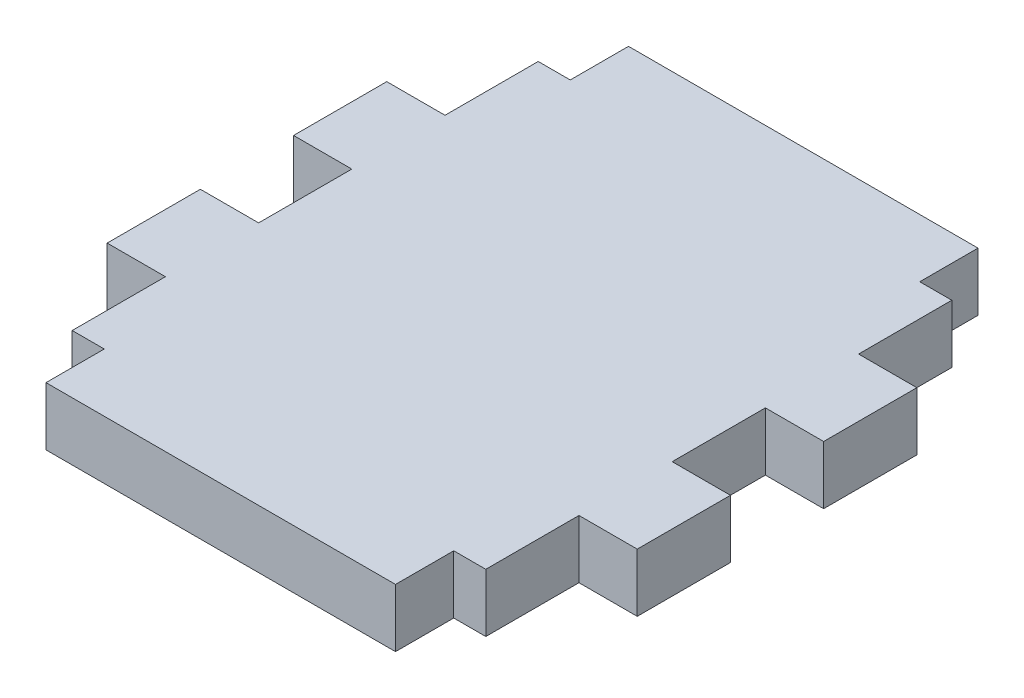
ISO-10303-21;
HEADER;
FILE_DESCRIPTION(('STEP AP214'),'2;1');
FILE_NAME('part.step','',(''),(''),'','','');
FILE_SCHEMA(('AUTOMOTIVE_DESIGN { 1 0 10303 214 1 1 1 1 }'));
ENDSEC;
DATA;
#1=APPLICATION_CONTEXT('core data for automotive mechanical design processes');
#2=APPLICATION_PROTOCOL_DEFINITION('international standard','automotive_design',2000,#1);
#3=PRODUCT_CONTEXT('',#1,'mechanical');
#4=PRODUCT('Part','Part','',(#3));
#5=PRODUCT_RELATED_PRODUCT_CATEGORY('part','',(#4));
#6=PRODUCT_DEFINITION_FORMATION('','',#4);
#7=PRODUCT_DEFINITION_CONTEXT('part definition',#1,'design');
#8=PRODUCT_DEFINITION('design','',#6,#7);
#9=PRODUCT_DEFINITION_SHAPE('','',#8);
#10=(LENGTH_UNIT() NAMED_UNIT(*) SI_UNIT(.MILLI.,.METRE.));
#11=(NAMED_UNIT(*) PLANE_ANGLE_UNIT() SI_UNIT($,.RADIAN.));
#12=(NAMED_UNIT(*) SI_UNIT($,.STERADIAN.) SOLID_ANGLE_UNIT());
#13=UNCERTAINTY_MEASURE_WITH_UNIT(LENGTH_MEASURE(1.E-05),#10,'distance_accuracy_value','');
#14=(GEOMETRIC_REPRESENTATION_CONTEXT(3) GLOBAL_UNCERTAINTY_ASSIGNED_CONTEXT((#13)) GLOBAL_UNIT_ASSIGNED_CONTEXT((#10,
#11,#12)) REPRESENTATION_CONTEXT('',''));
#15=CARTESIAN_POINT('',(0.,0.,0.));
#16=DIRECTION('',(0.,0.,1.));
#17=DIRECTION('',(1.,0.,0.));
#18=AXIS2_PLACEMENT_3D('',#15,#16,#17);
#19=CARTESIAN_POINT('',(-56.4007350410217,3.,-6.46052951119867));
#20=DIRECTION('',(0.,0.,1.));
#21=DIRECTION('',(1.,0.,0.));
#22=AXIS2_PLACEMENT_3D('',#19,#20,#21);
#23=PLANE('',#22);
#24=DIRECTION('',(-1.,0.,0.));
#25=VECTOR('',#24,1.);
#26=CARTESIAN_POINT('',(-56.4007350410217,0.,-6.46052951119867));
#27=LINE('',#26,#25);
#28=CARTESIAN_POINT('',(-56.4007350410217,0.,-6.46052951119867));
#29=VERTEX_POINT('',#28);
#30=CARTESIAN_POINT('',(-58.0507350410217,0.,-6.46052951119867));
#31=VERTEX_POINT('',#30);
#32=EDGE_CURVE('E260',#29,#31,#27,.T.);
#33=ORIENTED_EDGE('',*,*,#32,.T.);
#34=DIRECTION('',(0.,-1.,0.));
#35=VECTOR('',#34,1.);
#36=CARTESIAN_POINT('',(-58.0507350410217,3.,-6.46052951119867));
#37=LINE('',#36,#35);
#38=CARTESIAN_POINT('',(-58.0507350410217,3.,-6.46052951119867));
#39=VERTEX_POINT('',#38);
#40=EDGE_CURVE('E11',#39,#31,#37,.T.);
#41=ORIENTED_EDGE('',*,*,#40,.F.);
#42=DIRECTION('',(-1.,0.,0.));
#43=VECTOR('',#42,1.);
#44=CARTESIAN_POINT('',(-56.4007350410217,3.,-6.46052951119867));
#45=LINE('',#44,#43);
#46=CARTESIAN_POINT('',(-56.4007350410217,3.,-6.46052951119867));
#47=VERTEX_POINT('',#46);
#48=EDGE_CURVE('E342',#47,#39,#45,.T.);
#49=ORIENTED_EDGE('',*,*,#48,.F.);
#50=DIRECTION('',(0.,-1.,0.));
#51=VECTOR('',#50,1.);
#52=CARTESIAN_POINT('',(-56.4007350410217,3.,-6.46052951119867));
#53=LINE('',#52,#51);
#54=EDGE_CURVE('E256',#47,#29,#53,.T.);
#55=ORIENTED_EDGE('',*,*,#54,.T.);
#56=EDGE_LOOP('',(#33,#41,#49,#55));
#57=FACE_BOUND('',#56,.T.);
#58=ADVANCED_FACE('F39',(#57),#23,.F.);
#59=CARTESIAN_POINT('',(-58.0507350410217,3.,-6.46052951119867));
#60=DIRECTION('',(1.,0.,0.));
#61=DIRECTION('',(0.,0.,-1.));
#62=AXIS2_PLACEMENT_3D('',#59,#60,#61);
#63=PLANE('',#62);
#64=DIRECTION('',(0.,0.,1.));
#65=VECTOR('',#64,1.);
#66=CARTESIAN_POINT('',(-58.0507350410217,0.,-6.46052951119867));
#67=LINE('',#66,#65);
#68=CARTESIAN_POINT('',(-58.0507350410217,0.,-1.66052951119866));
#69=VERTEX_POINT('',#68);
#70=EDGE_CURVE('E264',#31,#69,#67,.T.);
#71=ORIENTED_EDGE('',*,*,#70,.T.);
#72=DIRECTION('',(0.,-1.,0.));
#73=VECTOR('',#72,1.);
#74=CARTESIAN_POINT('',(-58.0507350410217,3.,-1.66052951119866));
#75=LINE('',#74,#73);
#76=CARTESIAN_POINT('',(-58.0507350410217,3.,-1.66052951119866));
#77=VERTEX_POINT('',#76);
#78=EDGE_CURVE('E48',#77,#69,#75,.T.);
#79=ORIENTED_EDGE('',*,*,#78,.F.);
#80=DIRECTION('',(0.,0.,1.));
#81=VECTOR('',#80,1.);
#82=CARTESIAN_POINT('',(-58.0507350410217,3.,-6.46052951119867));
#83=LINE('',#82,#81);
#84=EDGE_CURVE('E159',#39,#77,#83,.T.);
#85=ORIENTED_EDGE('',*,*,#84,.F.);
#86=ORIENTED_EDGE('',*,*,#40,.T.);
#87=EDGE_LOOP('',(#71,#79,#85,#86));
#88=FACE_BOUND('',#87,.T.);
#89=ADVANCED_FACE('F548',(#88),#63,.F.);
#90=CARTESIAN_POINT('',(-61.0507350410217,3.,-1.66052951119866));
#91=DIRECTION('',(0.,0.,1.));
#92=DIRECTION('',(1.,0.,0.));
#93=AXIS2_PLACEMENT_3D('',#90,#91,#92);
#94=PLANE('',#93);
#95=DIRECTION('',(-1.,0.,0.));
#96=VECTOR('',#95,1.);
#97=CARTESIAN_POINT('',(-61.0507350410217,0.,-1.66052951119866));
#98=LINE('',#97,#96);
#99=CARTESIAN_POINT('',(-61.0507350410217,0.,-1.66052951119866));
#100=VERTEX_POINT('',#99);
#101=EDGE_CURVE('E267',#69,#100,#98,.T.);
#102=ORIENTED_EDGE('',*,*,#101,.T.);
#103=DIRECTION('',(0.,-1.,0.));
#104=VECTOR('',#103,1.);
#105=CARTESIAN_POINT('',(-61.0507350410217,3.,-1.66052951119866));
#106=LINE('',#105,#104);
#107=CARTESIAN_POINT('',(-61.0507350410217,3.,-1.66052951119866));
#108=VERTEX_POINT('',#107);
#109=EDGE_CURVE('E433',#108,#100,#106,.T.);
#110=ORIENTED_EDGE('',*,*,#109,.F.);
#111=DIRECTION('',(-1.,0.,0.));
#112=VECTOR('',#111,1.);
#113=CARTESIAN_POINT('',(-61.0507350410217,3.,-1.66052951119866));
#114=LINE('',#113,#112);
#115=EDGE_CURVE('E443',#77,#108,#114,.T.);
#116=ORIENTED_EDGE('',*,*,#115,.F.);
#117=ORIENTED_EDGE('',*,*,#78,.T.);
#118=EDGE_LOOP('',(#102,#110,#116,#117));
#119=FACE_BOUND('',#118,.T.);
#120=ADVANCED_FACE('F441',(#119),#94,.F.);
#121=CARTESIAN_POINT('',(-61.0507350410217,3.,-1.66052951119866));
#122=DIRECTION('',(1.,0.,0.));
#123=DIRECTION('',(0.,0.,-1.));
#124=AXIS2_PLACEMENT_3D('',#121,#122,#123);
#125=PLANE('',#124);
#126=DIRECTION('',(0.,0.,1.));
#127=VECTOR('',#126,1.);
#128=CARTESIAN_POINT('',(-61.0507350410217,0.,-1.66052951119866));
#129=LINE('',#128,#127);
#130=CARTESIAN_POINT('',(-61.0507350410217,0.,3.13947048880134));
#131=VERTEX_POINT('',#130);
#132=EDGE_CURVE('E270',#100,#131,#129,.T.);
#133=ORIENTED_EDGE('',*,*,#132,.T.);
#134=DIRECTION('',(0.,-1.,0.));
#135=VECTOR('',#134,1.);
#136=CARTESIAN_POINT('',(-61.0507350410217,3.,3.13947048880134));
#137=LINE('',#136,#135);
#138=CARTESIAN_POINT('',(-61.0507350410217,3.,3.13947048880134));
#139=VERTEX_POINT('',#138);
#140=EDGE_CURVE('E429',#139,#131,#137,.T.);
#141=ORIENTED_EDGE('',*,*,#140,.F.);
#142=DIRECTION('',(0.,0.,1.));
#143=VECTOR('',#142,1.);
#144=CARTESIAN_POINT('',(-61.0507350410217,3.,-1.66052951119866));
#145=LINE('',#144,#143);
#146=EDGE_CURVE('E462',#108,#139,#145,.T.);
#147=ORIENTED_EDGE('',*,*,#146,.F.);
#148=ORIENTED_EDGE('',*,*,#109,.T.);
#149=EDGE_LOOP('',(#133,#141,#147,#148));
#150=FACE_BOUND('',#149,.T.);
#151=ADVANCED_FACE('F452',(#150),#125,.F.);
#152=CARTESIAN_POINT('',(-61.0507350410217,3.,3.13947048880134));
#153=DIRECTION('',(0.,0.,-1.));
#154=DIRECTION('',(-1.,0.,0.));
#155=AXIS2_PLACEMENT_3D('',#152,#153,#154);
#156=PLANE('',#155);
#157=DIRECTION('',(1.,0.,0.));
#158=VECTOR('',#157,1.);
#159=CARTESIAN_POINT('',(-61.0507350410217,0.,3.13947048880134));
#160=LINE('',#159,#158);
#161=CARTESIAN_POINT('',(-58.0507350410217,0.,3.13947048880134));
#162=VERTEX_POINT('',#161);
#163=EDGE_CURVE('E273',#131,#162,#160,.T.);
#164=ORIENTED_EDGE('',*,*,#163,.T.);
#165=DIRECTION('',(0.,-1.,0.));
#166=VECTOR('',#165,1.);
#167=CARTESIAN_POINT('',(-58.0507350410217,3.,3.13947048880134));
#168=LINE('',#167,#166);
#169=CARTESIAN_POINT('',(-58.0507350410217,3.,3.13947048880134));
#170=VERTEX_POINT('',#169);
#171=EDGE_CURVE('E425',#170,#162,#168,.T.);
#172=ORIENTED_EDGE('',*,*,#171,.F.);
#173=DIRECTION('',(1.,0.,0.));
#174=VECTOR('',#173,1.);
#175=CARTESIAN_POINT('',(-61.0507350410217,3.,3.13947048880134));
#176=LINE('',#175,#174);
#177=EDGE_CURVE('E458',#139,#170,#176,.T.);
#178=ORIENTED_EDGE('',*,*,#177,.F.);
#179=ORIENTED_EDGE('',*,*,#140,.T.);
#180=EDGE_LOOP('',(#164,#172,#178,#179));
#181=FACE_BOUND('',#180,.T.);
#182=ADVANCED_FACE('F456',(#181),#156,.F.);
#183=CARTESIAN_POINT('',(-58.0507350410217,3.,3.13947048880134));
#184=DIRECTION('',(1.,0.,0.));
#185=DIRECTION('',(0.,0.,-1.));
#186=AXIS2_PLACEMENT_3D('',#183,#184,#185);
#187=PLANE('',#186);
#188=DIRECTION('',(0.,0.,1.));
#189=VECTOR('',#188,1.);
#190=CARTESIAN_POINT('',(-58.0507350410217,0.,3.13947048880134));
#191=LINE('',#190,#189);
#192=CARTESIAN_POINT('',(-58.0507350410217,0.,7.93947048880134));
#193=VERTEX_POINT('',#192);
#194=EDGE_CURVE('E276',#162,#193,#191,.T.);
#195=ORIENTED_EDGE('',*,*,#194,.T.);
#196=DIRECTION('',(0.,-1.,0.));
#197=VECTOR('',#196,1.);
#198=CARTESIAN_POINT('',(-58.0507350410217,3.,7.93947048880134));
#199=LINE('',#198,#197);
#200=CARTESIAN_POINT('',(-58.0507350410217,3.,7.93947048880134));
#201=VERTEX_POINT('',#200);
#202=EDGE_CURVE('E421',#201,#193,#199,.T.);
#203=ORIENTED_EDGE('',*,*,#202,.F.);
#204=DIRECTION('',(0.,0.,1.));
#205=VECTOR('',#204,1.);
#206=CARTESIAN_POINT('',(-58.0507350410217,3.,3.13947048880134));
#207=LINE('',#206,#205);
#208=EDGE_CURVE('E461',#170,#201,#207,.T.);
#209=ORIENTED_EDGE('',*,*,#208,.F.);
#210=ORIENTED_EDGE('',*,*,#171,.T.);
#211=EDGE_LOOP('',(#195,#203,#209,#210));
#212=FACE_BOUND('',#211,.T.);
#213=ADVANCED_FACE('F561',(#212),#187,.F.);
#214=CARTESIAN_POINT('',(-58.0507350410217,3.,7.93947048880134));
#215=DIRECTION('',(0.,0.,1.));
#216=DIRECTION('',(1.,0.,0.));
#217=AXIS2_PLACEMENT_3D('',#214,#215,#216);
#218=PLANE('',#217);
#219=DIRECTION('',(-1.,0.,0.));
#220=VECTOR('',#219,1.);
#221=CARTESIAN_POINT('',(-58.0507350410217,0.,7.93947048880134));
#222=LINE('',#221,#220);
#223=CARTESIAN_POINT('',(-61.0507350410217,0.,7.93947048880134));
#224=VERTEX_POINT('',#223);
#225=EDGE_CURVE('E279',#193,#224,#222,.T.);
#226=ORIENTED_EDGE('',*,*,#225,.T.);
#227=DIRECTION('',(0.,-1.,0.));
#228=VECTOR('',#227,1.);
#229=CARTESIAN_POINT('',(-61.0507350410217,3.,7.93947048880134));
#230=LINE('',#229,#228);
#231=CARTESIAN_POINT('',(-61.0507350410217,3.,7.93947048880134));
#232=VERTEX_POINT('',#231);
#233=EDGE_CURVE('E417',#232,#224,#230,.T.);
#234=ORIENTED_EDGE('',*,*,#233,.F.);
#235=DIRECTION('',(-1.,0.,0.));
#236=VECTOR('',#235,1.);
#237=CARTESIAN_POINT('',(-58.0507350410217,3.,7.93947048880134));
#238=LINE('',#237,#236);
#239=EDGE_CURVE('E466',#201,#232,#238,.T.);
#240=ORIENTED_EDGE('',*,*,#239,.F.);
#241=ORIENTED_EDGE('',*,*,#202,.T.);
#242=EDGE_LOOP('',(#226,#234,#240,#241));
#243=FACE_BOUND('',#242,.T.);
#244=ADVANCED_FACE('F564',(#243),#218,.F.);
#245=CARTESIAN_POINT('',(-61.0507350410217,3.,7.93947048880134));
#246=DIRECTION('',(1.,0.,0.));
#247=DIRECTION('',(0.,0.,-1.));
#248=AXIS2_PLACEMENT_3D('',#245,#246,#247);
#249=PLANE('',#248);
#250=DIRECTION('',(0.,0.,1.));
#251=VECTOR('',#250,1.);
#252=CARTESIAN_POINT('',(-61.0507350410217,0.,7.93947048880134));
#253=LINE('',#252,#251);
#254=CARTESIAN_POINT('',(-61.0507350410217,0.,12.7394704888013));
#255=VERTEX_POINT('',#254);
#256=EDGE_CURVE('E282',#224,#255,#253,.T.);
#257=ORIENTED_EDGE('',*,*,#256,.T.);
#258=DIRECTION('',(0.,-1.,0.));
#259=VECTOR('',#258,1.);
#260=CARTESIAN_POINT('',(-61.0507350410217,3.,12.7394704888013));
#261=LINE('',#260,#259);
#262=CARTESIAN_POINT('',(-61.0507350410217,3.,12.7394704888013));
#263=VERTEX_POINT('',#262);
#264=EDGE_CURVE('E413',#263,#255,#261,.T.);
#265=ORIENTED_EDGE('',*,*,#264,.F.);
#266=DIRECTION('',(0.,0.,1.));
#267=VECTOR('',#266,1.);
#268=CARTESIAN_POINT('',(-61.0507350410217,3.,7.93947048880134));
#269=LINE('',#268,#267);
#270=EDGE_CURVE('E473',#232,#263,#269,.T.);
#271=ORIENTED_EDGE('',*,*,#270,.F.);
#272=ORIENTED_EDGE('',*,*,#233,.T.);
#273=EDGE_LOOP('',(#257,#265,#271,#272));
#274=FACE_BOUND('',#273,.T.);
#275=ADVANCED_FACE('F568',(#274),#249,.F.);
#276=CARTESIAN_POINT('',(-58.0507350410217,3.,12.7394704888013));
#277=DIRECTION('',(0.,0.,-1.));
#278=DIRECTION('',(-1.,0.,0.));
#279=AXIS2_PLACEMENT_3D('',#276,#277,#278);
#280=PLANE('',#279);
#281=DIRECTION('',(1.,0.,0.));
#282=VECTOR('',#281,1.);
#283=CARTESIAN_POINT('',(-58.0507350410217,0.,12.7394704888013));
#284=LINE('',#283,#282);
#285=CARTESIAN_POINT('',(-58.0507350410217,0.,12.7394704888013));
#286=VERTEX_POINT('',#285);
#287=EDGE_CURVE('E285',#255,#286,#284,.T.);
#288=ORIENTED_EDGE('',*,*,#287,.T.);
#289=DIRECTION('',(0.,-1.,0.));
#290=VECTOR('',#289,1.);
#291=CARTESIAN_POINT('',(-58.0507350410217,3.,12.7394704888013));
#292=LINE('',#291,#290);
#293=CARTESIAN_POINT('',(-58.0507350410217,3.,12.7394704888013));
#294=VERTEX_POINT('',#293);
#295=EDGE_CURVE('E409',#294,#286,#292,.T.);
#296=ORIENTED_EDGE('',*,*,#295,.F.);
#297=DIRECTION('',(1.,0.,0.));
#298=VECTOR('',#297,1.);
#299=CARTESIAN_POINT('',(-58.0507350410217,3.,12.7394704888013));
#300=LINE('',#299,#298);
#301=EDGE_CURVE('E476',#263,#294,#300,.T.);
#302=ORIENTED_EDGE('',*,*,#301,.F.);
#303=ORIENTED_EDGE('',*,*,#264,.T.);
#304=EDGE_LOOP('',(#288,#296,#302,#303));
#305=FACE_BOUND('',#304,.T.);
#306=ADVANCED_FACE('F572',(#305),#280,.F.);
#307=CARTESIAN_POINT('',(-58.0507350410217,3.,17.5394704888013));
#308=DIRECTION('',(1.,0.,0.));
#309=DIRECTION('',(0.,0.,-1.));
#310=AXIS2_PLACEMENT_3D('',#307,#308,#309);
#311=PLANE('',#310);
#312=DIRECTION('',(0.,0.,1.));
#313=VECTOR('',#312,1.);
#314=CARTESIAN_POINT('',(-58.0507350410217,0.,17.5394704888013));
#315=LINE('',#314,#313);
#316=CARTESIAN_POINT('',(-58.0507350410217,0.,17.5394704888013));
#317=VERTEX_POINT('',#316);
#318=EDGE_CURVE('E288',#286,#317,#315,.T.);
#319=ORIENTED_EDGE('',*,*,#318,.T.);
#320=DIRECTION('',(0.,-1.,0.));
#321=VECTOR('',#320,1.);
#322=CARTESIAN_POINT('',(-58.0507350410217,3.,17.5394704888013));
#323=LINE('',#322,#321);
#324=CARTESIAN_POINT('',(-58.0507350410217,3.,17.5394704888013));
#325=VERTEX_POINT('',#324);
#326=EDGE_CURVE('E405',#325,#317,#323,.T.);
#327=ORIENTED_EDGE('',*,*,#326,.F.);
#328=DIRECTION('',(0.,0.,1.));
#329=VECTOR('',#328,1.);
#330=CARTESIAN_POINT('',(-58.0507350410217,3.,17.5394704888013));
#331=LINE('',#330,#329);
#332=EDGE_CURVE('E479',#294,#325,#331,.T.);
#333=ORIENTED_EDGE('',*,*,#332,.F.);
#334=ORIENTED_EDGE('',*,*,#295,.T.);
#335=EDGE_LOOP('',(#319,#327,#333,#334));
#336=FACE_BOUND('',#335,.T.);
#337=ADVANCED_FACE('F576',(#336),#311,.F.);
#338=CARTESIAN_POINT('',(-56.4007350410217,3.,17.5394704888013));
#339=DIRECTION('',(0.,0.,-1.));
#340=DIRECTION('',(-1.,0.,0.));
#341=AXIS2_PLACEMENT_3D('',#338,#339,#340);
#342=PLANE('',#341);
#343=DIRECTION('',(1.,0.,0.));
#344=VECTOR('',#343,1.);
#345=CARTESIAN_POINT('',(-56.4007350410217,0.,17.5394704888013));
#346=LINE('',#345,#344);
#347=CARTESIAN_POINT('',(-56.4007350410217,0.,17.5394704888013));
#348=VERTEX_POINT('',#347);
#349=EDGE_CURVE('E291',#317,#348,#346,.T.);
#350=ORIENTED_EDGE('',*,*,#349,.T.);
#351=DIRECTION('',(0.,-1.,0.));
#352=VECTOR('',#351,1.);
#353=CARTESIAN_POINT('',(-56.4007350410217,3.,17.5394704888013));
#354=LINE('',#353,#352);
#355=CARTESIAN_POINT('',(-56.4007350410217,3.,17.5394704888013));
#356=VERTEX_POINT('',#355);
#357=EDGE_CURVE('E401',#356,#348,#354,.T.);
#358=ORIENTED_EDGE('',*,*,#357,.F.);
#359=DIRECTION('',(1.,0.,0.));
#360=VECTOR('',#359,1.);
#361=CARTESIAN_POINT('',(-56.4007350410217,3.,17.5394704888013));
#362=LINE('',#361,#360);
#363=EDGE_CURVE('E482',#325,#356,#362,.T.);
#364=ORIENTED_EDGE('',*,*,#363,.F.);
#365=ORIENTED_EDGE('',*,*,#326,.T.);
#366=EDGE_LOOP('',(#350,#358,#364,#365));
#367=FACE_BOUND('',#366,.T.);
#368=ADVANCED_FACE('F580',(#367),#342,.F.);
#369=CARTESIAN_POINT('',(-56.4007350410217,3.,20.5394704888013));
#370=DIRECTION('',(1.,0.,0.));
#371=DIRECTION('',(0.,0.,-1.));
#372=AXIS2_PLACEMENT_3D('',#369,#370,#371);
#373=PLANE('',#372);
#374=DIRECTION('',(0.,0.,1.));
#375=VECTOR('',#374,1.);
#376=CARTESIAN_POINT('',(-56.4007350410217,0.,20.5394704888013));
#377=LINE('',#376,#375);
#378=CARTESIAN_POINT('',(-56.4007350410217,0.,20.5394704888013));
#379=VERTEX_POINT('',#378);
#380=EDGE_CURVE('E294',#348,#379,#377,.T.);
#381=ORIENTED_EDGE('',*,*,#380,.T.);
#382=DIRECTION('',(0.,-1.,0.));
#383=VECTOR('',#382,1.);
#384=CARTESIAN_POINT('',(-56.4007350410217,3.,20.5394704888013));
#385=LINE('',#384,#383);
#386=CARTESIAN_POINT('',(-56.4007350410217,3.,20.5394704888013));
#387=VERTEX_POINT('',#386);
#388=EDGE_CURVE('E397',#387,#379,#385,.T.);
#389=ORIENTED_EDGE('',*,*,#388,.F.);
#390=DIRECTION('',(0.,0.,1.));
#391=VECTOR('',#390,1.);
#392=CARTESIAN_POINT('',(-56.4007350410217,3.,20.5394704888013));
#393=LINE('',#392,#391);
#394=EDGE_CURVE('E485',#356,#387,#393,.T.);
#395=ORIENTED_EDGE('',*,*,#394,.F.);
#396=ORIENTED_EDGE('',*,*,#357,.T.);
#397=EDGE_LOOP('',(#381,#389,#395,#396));
#398=FACE_BOUND('',#397,.T.);
#399=ADVANCED_FACE('F584',(#398),#373,.F.);
#400=CARTESIAN_POINT('',(-38.4007350410217,3.,20.5394704888013));
#401=DIRECTION('',(0.,0.,-1.));
#402=DIRECTION('',(-1.,0.,0.));
#403=AXIS2_PLACEMENT_3D('',#400,#401,#402);
#404=PLANE('',#403);
#405=DIRECTION('',(1.,0.,0.));
#406=VECTOR('',#405,1.);
#407=CARTESIAN_POINT('',(-38.4007350410217,0.,20.5394704888013));
#408=LINE('',#407,#406);
#409=CARTESIAN_POINT('',(-38.4007350410217,0.,20.5394704888013));
#410=VERTEX_POINT('',#409);
#411=EDGE_CURVE('E297',#379,#410,#408,.T.);
#412=ORIENTED_EDGE('',*,*,#411,.T.);
#413=DIRECTION('',(0.,-1.,0.));
#414=VECTOR('',#413,1.);
#415=CARTESIAN_POINT('',(-38.4007350410217,3.,20.5394704888013));
#416=LINE('',#415,#414);
#417=CARTESIAN_POINT('',(-38.4007350410217,3.,20.5394704888013));
#418=VERTEX_POINT('',#417);
#419=EDGE_CURVE('E393',#418,#410,#416,.T.);
#420=ORIENTED_EDGE('',*,*,#419,.F.);
#421=DIRECTION('',(1.,0.,0.));
#422=VECTOR('',#421,1.);
#423=CARTESIAN_POINT('',(-38.4007350410217,3.,20.5394704888013));
#424=LINE('',#423,#422);
#425=EDGE_CURVE('E488',#387,#418,#424,.T.);
#426=ORIENTED_EDGE('',*,*,#425,.F.);
#427=ORIENTED_EDGE('',*,*,#388,.T.);
#428=EDGE_LOOP('',(#412,#420,#426,#427));
#429=FACE_BOUND('',#428,.T.);
#430=ADVANCED_FACE('F588',(#429),#404,.F.);
#431=CARTESIAN_POINT('',(-38.4007350410217,3.,17.5394704888014));
#432=DIRECTION('',(-1.,0.,0.));
#433=DIRECTION('',(0.,0.,1.));
#434=AXIS2_PLACEMENT_3D('',#431,#432,#433);
#435=PLANE('',#434);
#436=DIRECTION('',(0.,0.,-1.));
#437=VECTOR('',#436,1.);
#438=CARTESIAN_POINT('',(-38.4007350410217,0.,17.5394704888014));
#439=LINE('',#438,#437);
#440=CARTESIAN_POINT('',(-38.4007350410217,0.,17.5394704888014));
#441=VERTEX_POINT('',#440);
#442=EDGE_CURVE('E300',#410,#441,#439,.T.);
#443=ORIENTED_EDGE('',*,*,#442,.T.);
#444=DIRECTION('',(0.,-1.,0.));
#445=VECTOR('',#444,1.);
#446=CARTESIAN_POINT('',(-38.4007350410217,3.,17.5394704888014));
#447=LINE('',#446,#445);
#448=CARTESIAN_POINT('',(-38.4007350410217,3.,17.5394704888014));
#449=VERTEX_POINT('',#448);
#450=EDGE_CURVE('E389',#449,#441,#447,.T.);
#451=ORIENTED_EDGE('',*,*,#450,.F.);
#452=DIRECTION('',(0.,0.,-1.));
#453=VECTOR('',#452,1.);
#454=CARTESIAN_POINT('',(-38.4007350410217,3.,17.5394704888014));
#455=LINE('',#454,#453);
#456=EDGE_CURVE('E491',#418,#449,#455,.T.);
#457=ORIENTED_EDGE('',*,*,#456,.F.);
#458=ORIENTED_EDGE('',*,*,#419,.T.);
#459=EDGE_LOOP('',(#443,#451,#457,#458));
#460=FACE_BOUND('',#459,.T.);
#461=ADVANCED_FACE('F592',(#460),#435,.F.);
#462=CARTESIAN_POINT('',(-38.4007350410217,3.,17.5394704888014));
#463=DIRECTION('',(0.,0.,-1.));
#464=DIRECTION('',(-1.,0.,0.));
#465=AXIS2_PLACEMENT_3D('',#462,#463,#464);
#466=PLANE('',#465);
#467=DIRECTION('',(1.,0.,0.));
#468=VECTOR('',#467,1.);
#469=CARTESIAN_POINT('',(-38.4007350410217,0.,17.5394704888014));
#470=LINE('',#469,#468);
#471=CARTESIAN_POINT('',(-36.7507350410217,0.,17.5394704888014));
#472=VERTEX_POINT('',#471);
#473=EDGE_CURVE('E303',#441,#472,#470,.T.);
#474=ORIENTED_EDGE('',*,*,#473,.T.);
#475=DIRECTION('',(0.,-1.,0.));
#476=VECTOR('',#475,1.);
#477=CARTESIAN_POINT('',(-36.7507350410217,3.,17.5394704888014));
#478=LINE('',#477,#476);
#479=CARTESIAN_POINT('',(-36.7507350410217,3.,17.5394704888014));
#480=VERTEX_POINT('',#479);
#481=EDGE_CURVE('E385',#480,#472,#478,.T.);
#482=ORIENTED_EDGE('',*,*,#481,.F.);
#483=DIRECTION('',(1.,0.,0.));
#484=VECTOR('',#483,1.);
#485=CARTESIAN_POINT('',(-38.4007350410217,3.,17.5394704888014));
#486=LINE('',#485,#484);
#487=EDGE_CURVE('E494',#449,#480,#486,.T.);
#488=ORIENTED_EDGE('',*,*,#487,.F.);
#489=ORIENTED_EDGE('',*,*,#450,.T.);
#490=EDGE_LOOP('',(#474,#482,#488,#489));
#491=FACE_BOUND('',#490,.T.);
#492=ADVANCED_FACE('F596',(#491),#466,.F.);
#493=CARTESIAN_POINT('',(-36.7507350410217,3.,17.5394704888014));
#494=DIRECTION('',(-1.,0.,0.));
#495=DIRECTION('',(0.,0.,1.));
#496=AXIS2_PLACEMENT_3D('',#493,#494,#495);
#497=PLANE('',#496);
#498=DIRECTION('',(0.,0.,-1.));
#499=VECTOR('',#498,1.);
#500=CARTESIAN_POINT('',(-36.7507350410217,0.,17.5394704888014));
#501=LINE('',#500,#499);
#502=CARTESIAN_POINT('',(-36.7507350410217,0.,12.7394704888014));
#503=VERTEX_POINT('',#502);
#504=EDGE_CURVE('E306',#472,#503,#501,.T.);
#505=ORIENTED_EDGE('',*,*,#504,.T.);
#506=DIRECTION('',(0.,-1.,0.));
#507=VECTOR('',#506,1.);
#508=CARTESIAN_POINT('',(-36.7507350410217,3.,12.7394704888014));
#509=LINE('',#508,#507);
#510=CARTESIAN_POINT('',(-36.7507350410217,3.,12.7394704888014));
#511=VERTEX_POINT('',#510);
#512=EDGE_CURVE('E381',#511,#503,#509,.T.);
#513=ORIENTED_EDGE('',*,*,#512,.F.);
#514=DIRECTION('',(0.,0.,-1.));
#515=VECTOR('',#514,1.);
#516=CARTESIAN_POINT('',(-36.7507350410217,3.,17.5394704888014));
#517=LINE('',#516,#515);
#518=EDGE_CURVE('E497',#480,#511,#517,.T.);
#519=ORIENTED_EDGE('',*,*,#518,.F.);
#520=ORIENTED_EDGE('',*,*,#481,.T.);
#521=EDGE_LOOP('',(#505,#513,#519,#520));
#522=FACE_BOUND('',#521,.T.);
#523=ADVANCED_FACE('F600',(#522),#497,.F.);
#524=CARTESIAN_POINT('',(-33.7507350410217,3.,12.7394704888014));
#525=DIRECTION('',(0.,0.,-1.));
#526=DIRECTION('',(-1.,0.,0.));
#527=AXIS2_PLACEMENT_3D('',#524,#525,#526);
#528=PLANE('',#527);
#529=DIRECTION('',(1.,0.,0.));
#530=VECTOR('',#529,1.);
#531=CARTESIAN_POINT('',(-33.7507350410217,0.,12.7394704888014));
#532=LINE('',#531,#530);
#533=CARTESIAN_POINT('',(-33.7507350410217,0.,12.7394704888014));
#534=VERTEX_POINT('',#533);
#535=EDGE_CURVE('E309',#503,#534,#532,.T.);
#536=ORIENTED_EDGE('',*,*,#535,.T.);
#537=DIRECTION('',(0.,-1.,0.));
#538=VECTOR('',#537,1.);
#539=CARTESIAN_POINT('',(-33.7507350410217,3.,12.7394704888014));
#540=LINE('',#539,#538);
#541=CARTESIAN_POINT('',(-33.7507350410217,3.,12.7394704888014));
#542=VERTEX_POINT('',#541);
#543=EDGE_CURVE('E377',#542,#534,#540,.T.);
#544=ORIENTED_EDGE('',*,*,#543,.F.);
#545=DIRECTION('',(1.,0.,0.));
#546=VECTOR('',#545,1.);
#547=CARTESIAN_POINT('',(-33.7507350410217,3.,12.7394704888014));
#548=LINE('',#547,#546);
#549=EDGE_CURVE('E500',#511,#542,#548,.T.);
#550=ORIENTED_EDGE('',*,*,#549,.F.);
#551=ORIENTED_EDGE('',*,*,#512,.T.);
#552=EDGE_LOOP('',(#536,#544,#550,#551));
#553=FACE_BOUND('',#552,.T.);
#554=ADVANCED_FACE('F604',(#553),#528,.F.);
#555=CARTESIAN_POINT('',(-33.7507350410217,3.,7.93947048880137));
#556=DIRECTION('',(-1.,0.,0.));
#557=DIRECTION('',(0.,0.,1.));
#558=AXIS2_PLACEMENT_3D('',#555,#556,#557);
#559=PLANE('',#558);
#560=DIRECTION('',(0.,0.,-1.));
#561=VECTOR('',#560,1.);
#562=CARTESIAN_POINT('',(-33.7507350410217,0.,7.93947048880137));
#563=LINE('',#562,#561);
#564=CARTESIAN_POINT('',(-33.7507350410217,0.,7.93947048880137));
#565=VERTEX_POINT('',#564);
#566=EDGE_CURVE('E312',#534,#565,#563,.T.);
#567=ORIENTED_EDGE('',*,*,#566,.T.);
#568=DIRECTION('',(0.,-1.,0.));
#569=VECTOR('',#568,1.);
#570=CARTESIAN_POINT('',(-33.7507350410217,3.,7.93947048880137));
#571=LINE('',#570,#569);
#572=CARTESIAN_POINT('',(-33.7507350410217,3.,7.93947048880137));
#573=VERTEX_POINT('',#572);
#574=EDGE_CURVE('E373',#573,#565,#571,.T.);
#575=ORIENTED_EDGE('',*,*,#574,.F.);
#576=DIRECTION('',(0.,0.,-1.));
#577=VECTOR('',#576,1.);
#578=CARTESIAN_POINT('',(-33.7507350410217,3.,7.93947048880137));
#579=LINE('',#578,#577);
#580=EDGE_CURVE('E503',#542,#573,#579,.T.);
#581=ORIENTED_EDGE('',*,*,#580,.F.);
#582=ORIENTED_EDGE('',*,*,#543,.T.);
#583=EDGE_LOOP('',(#567,#575,#581,#582));
#584=FACE_BOUND('',#583,.T.);
#585=ADVANCED_FACE('F608',(#584),#559,.F.);
#586=CARTESIAN_POINT('',(-36.7507350410217,3.,7.93947048880137));
#587=DIRECTION('',(0.,0.,1.));
#588=DIRECTION('',(1.,0.,0.));
#589=AXIS2_PLACEMENT_3D('',#586,#587,#588);
#590=PLANE('',#589);
#591=DIRECTION('',(-1.,0.,0.));
#592=VECTOR('',#591,1.);
#593=CARTESIAN_POINT('',(-36.7507350410217,0.,7.93947048880137));
#594=LINE('',#593,#592);
#595=CARTESIAN_POINT('',(-36.7507350410217,0.,7.93947048880137));
#596=VERTEX_POINT('',#595);
#597=EDGE_CURVE('E315',#565,#596,#594,.T.);
#598=ORIENTED_EDGE('',*,*,#597,.T.);
#599=DIRECTION('',(0.,-1.,0.));
#600=VECTOR('',#599,1.);
#601=CARTESIAN_POINT('',(-36.7507350410217,3.,7.93947048880137));
#602=LINE('',#601,#600);
#603=CARTESIAN_POINT('',(-36.7507350410217,3.,7.93947048880137));
#604=VERTEX_POINT('',#603);
#605=EDGE_CURVE('E369',#604,#596,#602,.T.);
#606=ORIENTED_EDGE('',*,*,#605,.F.);
#607=DIRECTION('',(-1.,0.,0.));
#608=VECTOR('',#607,1.);
#609=CARTESIAN_POINT('',(-36.7507350410217,3.,7.93947048880137));
#610=LINE('',#609,#608);
#611=EDGE_CURVE('E506',#573,#604,#610,.T.);
#612=ORIENTED_EDGE('',*,*,#611,.F.);
#613=ORIENTED_EDGE('',*,*,#574,.T.);
#614=EDGE_LOOP('',(#598,#606,#612,#613));
#615=FACE_BOUND('',#614,.T.);
#616=ADVANCED_FACE('F612',(#615),#590,.F.);
#617=CARTESIAN_POINT('',(-36.7507350410217,3.,3.13947048880137));
#618=DIRECTION('',(-1.,0.,0.));
#619=DIRECTION('',(0.,0.,1.));
#620=AXIS2_PLACEMENT_3D('',#617,#618,#619);
#621=PLANE('',#620);
#622=DIRECTION('',(0.,0.,-1.));
#623=VECTOR('',#622,1.);
#624=CARTESIAN_POINT('',(-36.7507350410217,0.,3.13947048880137));
#625=LINE('',#624,#623);
#626=CARTESIAN_POINT('',(-36.7507350410217,0.,3.13947048880137));
#627=VERTEX_POINT('',#626);
#628=EDGE_CURVE('E318',#596,#627,#625,.T.);
#629=ORIENTED_EDGE('',*,*,#628,.T.);
#630=DIRECTION('',(0.,-1.,0.));
#631=VECTOR('',#630,1.);
#632=CARTESIAN_POINT('',(-36.7507350410217,3.,3.13947048880137));
#633=LINE('',#632,#631);
#634=CARTESIAN_POINT('',(-36.7507350410217,3.,3.13947048880137));
#635=VERTEX_POINT('',#634);
#636=EDGE_CURVE('E365',#635,#627,#633,.T.);
#637=ORIENTED_EDGE('',*,*,#636,.F.);
#638=DIRECTION('',(0.,0.,-1.));
#639=VECTOR('',#638,1.);
#640=CARTESIAN_POINT('',(-36.7507350410217,3.,3.13947048880137));
#641=LINE('',#640,#639);
#642=EDGE_CURVE('E509',#604,#635,#641,.T.);
#643=ORIENTED_EDGE('',*,*,#642,.F.);
#644=ORIENTED_EDGE('',*,*,#605,.T.);
#645=EDGE_LOOP('',(#629,#637,#643,#644));
#646=FACE_BOUND('',#645,.T.);
#647=ADVANCED_FACE('F616',(#646),#621,.F.);
#648=CARTESIAN_POINT('',(-33.7507350410217,3.,3.13947048880137));
#649=DIRECTION('',(0.,0.,-1.));
#650=DIRECTION('',(-1.,0.,0.));
#651=AXIS2_PLACEMENT_3D('',#648,#649,#650);
#652=PLANE('',#651);
#653=DIRECTION('',(1.,0.,0.));
#654=VECTOR('',#653,1.);
#655=CARTESIAN_POINT('',(-33.7507350410217,0.,3.13947048880137));
#656=LINE('',#655,#654);
#657=CARTESIAN_POINT('',(-33.7507350410217,0.,3.13947048880137));
#658=VERTEX_POINT('',#657);
#659=EDGE_CURVE('E321',#627,#658,#656,.T.);
#660=ORIENTED_EDGE('',*,*,#659,.T.);
#661=DIRECTION('',(0.,-1.,0.));
#662=VECTOR('',#661,1.);
#663=CARTESIAN_POINT('',(-33.7507350410217,3.,3.13947048880137));
#664=LINE('',#663,#662);
#665=CARTESIAN_POINT('',(-33.7507350410217,3.,3.13947048880137));
#666=VERTEX_POINT('',#665);
#667=EDGE_CURVE('E361',#666,#658,#664,.T.);
#668=ORIENTED_EDGE('',*,*,#667,.F.);
#669=DIRECTION('',(1.,0.,0.));
#670=VECTOR('',#669,1.);
#671=CARTESIAN_POINT('',(-33.7507350410217,3.,3.13947048880137));
#672=LINE('',#671,#670);
#673=EDGE_CURVE('E512',#635,#666,#672,.T.);
#674=ORIENTED_EDGE('',*,*,#673,.F.);
#675=ORIENTED_EDGE('',*,*,#636,.T.);
#676=EDGE_LOOP('',(#660,#668,#674,#675));
#677=FACE_BOUND('',#676,.T.);
#678=ADVANCED_FACE('F620',(#677),#652,.F.);
#679=CARTESIAN_POINT('',(-33.7507350410217,3.,-1.66052951119865));
#680=DIRECTION('',(-1.,0.,0.));
#681=DIRECTION('',(0.,0.,1.));
#682=AXIS2_PLACEMENT_3D('',#679,#680,#681);
#683=PLANE('',#682);
#684=DIRECTION('',(0.,0.,-1.));
#685=VECTOR('',#684,1.);
#686=CARTESIAN_POINT('',(-33.7507350410217,0.,-1.66052951119865));
#687=LINE('',#686,#685);
#688=CARTESIAN_POINT('',(-33.7507350410217,0.,-1.66052951119865));
#689=VERTEX_POINT('',#688);
#690=EDGE_CURVE('E324',#658,#689,#687,.T.);
#691=ORIENTED_EDGE('',*,*,#690,.T.);
#692=DIRECTION('',(0.,-1.,0.));
#693=VECTOR('',#692,1.);
#694=CARTESIAN_POINT('',(-33.7507350410217,3.,-1.66052951119865));
#695=LINE('',#694,#693);
#696=CARTESIAN_POINT('',(-33.7507350410217,3.,-1.66052951119865));
#697=VERTEX_POINT('',#696);
#698=EDGE_CURVE('E357',#697,#689,#695,.T.);
#699=ORIENTED_EDGE('',*,*,#698,.F.);
#700=DIRECTION('',(0.,0.,-1.));
#701=VECTOR('',#700,1.);
#702=CARTESIAN_POINT('',(-33.7507350410217,3.,-1.66052951119865));
#703=LINE('',#702,#701);
#704=EDGE_CURVE('E515',#666,#697,#703,.T.);
#705=ORIENTED_EDGE('',*,*,#704,.F.);
#706=ORIENTED_EDGE('',*,*,#667,.T.);
#707=EDGE_LOOP('',(#691,#699,#705,#706));
#708=FACE_BOUND('',#707,.T.);
#709=ADVANCED_FACE('F624',(#708),#683,.F.);
#710=CARTESIAN_POINT('',(-36.7507350410217,3.,-1.66052951119865));
#711=DIRECTION('',(0.,0.,1.));
#712=DIRECTION('',(1.,0.,0.));
#713=AXIS2_PLACEMENT_3D('',#710,#711,#712);
#714=PLANE('',#713);
#715=DIRECTION('',(-1.,0.,0.));
#716=VECTOR('',#715,1.);
#717=CARTESIAN_POINT('',(-36.7507350410217,0.,-1.66052951119865));
#718=LINE('',#717,#716);
#719=CARTESIAN_POINT('',(-36.7507350410217,0.,-1.66052951119865));
#720=VERTEX_POINT('',#719);
#721=EDGE_CURVE('E327',#689,#720,#718,.T.);
#722=ORIENTED_EDGE('',*,*,#721,.T.);
#723=DIRECTION('',(0.,-1.,0.));
#724=VECTOR('',#723,1.);
#725=CARTESIAN_POINT('',(-36.7507350410217,3.,-1.66052951119865));
#726=LINE('',#725,#724);
#727=CARTESIAN_POINT('',(-36.7507350410217,3.,-1.66052951119865));
#728=VERTEX_POINT('',#727);
#729=EDGE_CURVE('E353',#728,#720,#726,.T.);
#730=ORIENTED_EDGE('',*,*,#729,.F.);
#731=DIRECTION('',(-1.,0.,0.));
#732=VECTOR('',#731,1.);
#733=CARTESIAN_POINT('',(-36.7507350410217,3.,-1.66052951119865));
#734=LINE('',#733,#732);
#735=EDGE_CURVE('E518',#697,#728,#734,.T.);
#736=ORIENTED_EDGE('',*,*,#735,.F.);
#737=ORIENTED_EDGE('',*,*,#698,.T.);
#738=EDGE_LOOP('',(#722,#730,#736,#737));
#739=FACE_BOUND('',#738,.T.);
#740=ADVANCED_FACE('F628',(#739),#714,.F.);
#741=CARTESIAN_POINT('',(-36.7507350410216,3.,-6.46052951119867));
#742=DIRECTION('',(-1.,0.,0.));
#743=DIRECTION('',(0.,0.,1.));
#744=AXIS2_PLACEMENT_3D('',#741,#742,#743);
#745=PLANE('',#744);
#746=DIRECTION('',(0.,0.,-1.));
#747=VECTOR('',#746,1.);
#748=CARTESIAN_POINT('',(-36.7507350410216,0.,-6.46052951119867));
#749=LINE('',#748,#747);
#750=CARTESIAN_POINT('',(-36.7507350410216,0.,-6.46052951119867));
#751=VERTEX_POINT('',#750);
#752=EDGE_CURVE('E330',#720,#751,#749,.T.);
#753=ORIENTED_EDGE('',*,*,#752,.T.);
#754=DIRECTION('',(0.,-1.,0.));
#755=VECTOR('',#754,1.);
#756=CARTESIAN_POINT('',(-36.7507350410216,3.,-6.46052951119867));
#757=LINE('',#756,#755);
#758=CARTESIAN_POINT('',(-36.7507350410216,3.,-6.46052951119867));
#759=VERTEX_POINT('',#758);
#760=EDGE_CURVE('E349',#759,#751,#757,.T.);
#761=ORIENTED_EDGE('',*,*,#760,.F.);
#762=DIRECTION('',(0.,0.,-1.));
#763=VECTOR('',#762,1.);
#764=CARTESIAN_POINT('',(-36.7507350410216,3.,-6.46052951119867));
#765=LINE('',#764,#763);
#766=EDGE_CURVE('E521',#728,#759,#765,.T.);
#767=ORIENTED_EDGE('',*,*,#766,.F.);
#768=ORIENTED_EDGE('',*,*,#729,.T.);
#769=EDGE_LOOP('',(#753,#761,#767,#768));
#770=FACE_BOUND('',#769,.T.);
#771=ADVANCED_FACE('F529',(#770),#745,.F.);
#772=CARTESIAN_POINT('',(-38.4007350410216,3.,-6.46052951119867));
#773=DIRECTION('',(0.,0.,1.));
#774=DIRECTION('',(1.,0.,0.));
#775=AXIS2_PLACEMENT_3D('',#772,#773,#774);
#776=PLANE('',#775);
#777=DIRECTION('',(-1.,0.,0.));
#778=VECTOR('',#777,1.);
#779=CARTESIAN_POINT('',(-38.4007350410216,0.,-6.46052951119867));
#780=LINE('',#779,#778);
#781=CARTESIAN_POINT('',(-38.4007350410216,0.,-6.46052951119867));
#782=VERTEX_POINT('',#781);
#783=EDGE_CURVE('E333',#751,#782,#780,.T.);
#784=ORIENTED_EDGE('',*,*,#783,.T.);
#785=DIRECTION('',(0.,-1.,0.));
#786=VECTOR('',#785,1.);
#787=CARTESIAN_POINT('',(-38.4007350410216,3.,-6.46052951119867));
#788=LINE('',#787,#786);
#789=CARTESIAN_POINT('',(-38.4007350410216,3.,-6.46052951119867));
#790=VERTEX_POINT('',#789);
#791=EDGE_CURVE('E249',#790,#782,#788,.T.);
#792=ORIENTED_EDGE('',*,*,#791,.F.);
#793=DIRECTION('',(-1.,0.,0.));
#794=VECTOR('',#793,1.);
#795=CARTESIAN_POINT('',(-38.4007350410216,3.,-6.46052951119867));
#796=LINE('',#795,#794);
#797=EDGE_CURVE('E238',#759,#790,#796,.T.);
#798=ORIENTED_EDGE('',*,*,#797,.F.);
#799=ORIENTED_EDGE('',*,*,#760,.T.);
#800=EDGE_LOOP('',(#784,#792,#798,#799));
#801=FACE_BOUND('',#800,.T.);
#802=ADVANCED_FACE('F533',(#801),#776,.F.);
#803=CARTESIAN_POINT('',(-38.4007350410216,3.,-9.46052951119866));
#804=DIRECTION('',(-1.,0.,0.));
#805=DIRECTION('',(0.,0.,1.));
#806=AXIS2_PLACEMENT_3D('',#803,#804,#805);
#807=PLANE('',#806);
#808=DIRECTION('',(0.,0.,-1.));
#809=VECTOR('',#808,1.);
#810=CARTESIAN_POINT('',(-38.4007350410216,0.,-9.46052951119866));
#811=LINE('',#810,#809);
#812=CARTESIAN_POINT('',(-38.4007350410216,0.,-9.46052951119866));
#813=VERTEX_POINT('',#812);
#814=EDGE_CURVE('E247',#782,#813,#811,.T.);
#815=ORIENTED_EDGE('',*,*,#814,.T.);
#816=DIRECTION('',(0.,-1.,0.));
#817=VECTOR('',#816,1.);
#818=CARTESIAN_POINT('',(-38.4007350410216,3.,-9.46052951119866));
#819=LINE('',#818,#817);
#820=CARTESIAN_POINT('',(-38.4007350410216,3.,-9.46052951119866));
#821=VERTEX_POINT('',#820);
#822=EDGE_CURVE('E244',#821,#813,#819,.T.);
#823=ORIENTED_EDGE('',*,*,#822,.F.);
#824=DIRECTION('',(0.,0.,-1.));
#825=VECTOR('',#824,1.);
#826=CARTESIAN_POINT('',(-38.4007350410216,3.,-9.46052951119866));
#827=LINE('',#826,#825);
#828=EDGE_CURVE('E232',#790,#821,#827,.T.);
#829=ORIENTED_EDGE('',*,*,#828,.F.);
#830=ORIENTED_EDGE('',*,*,#791,.T.);
#831=EDGE_LOOP('',(#815,#823,#829,#830));
#832=FACE_BOUND('',#831,.T.);
#833=ADVANCED_FACE('F245',(#832),#807,.F.);
#834=CARTESIAN_POINT('',(-56.4007350410217,3.,-9.46052951119866));
#835=DIRECTION('',(0.,0.,1.));
#836=DIRECTION('',(1.,0.,0.));
#837=AXIS2_PLACEMENT_3D('',#834,#835,#836);
#838=PLANE('',#837);
#839=DIRECTION('',(-1.,0.,0.));
#840=VECTOR('',#839,1.);
#841=CARTESIAN_POINT('',(-56.4007350410217,0.,-9.46052951119866));
#842=LINE('',#841,#840);
#843=CARTESIAN_POINT('',(-56.4007350410217,0.,-9.46052951119866));
#844=VERTEX_POINT('',#843);
#845=EDGE_CURVE('E145',#813,#844,#842,.T.);
#846=ORIENTED_EDGE('',*,*,#845,.T.);
#847=DIRECTION('',(0.,-1.,0.));
#848=VECTOR('',#847,1.);
#849=CARTESIAN_POINT('',(-56.4007350410217,3.,-9.46052951119866));
#850=LINE('',#849,#848);
#851=CARTESIAN_POINT('',(-56.4007350410217,3.,-9.46052951119866));
#852=VERTEX_POINT('',#851);
#853=EDGE_CURVE('E250',#852,#844,#850,.T.);
#854=ORIENTED_EDGE('',*,*,#853,.F.);
#855=DIRECTION('',(-1.,0.,0.));
#856=VECTOR('',#855,1.);
#857=CARTESIAN_POINT('',(-56.4007350410217,3.,-9.46052951119866));
#858=LINE('',#857,#856);
#859=EDGE_CURVE('E236',#821,#852,#858,.T.);
#860=ORIENTED_EDGE('',*,*,#859,.F.);
#861=ORIENTED_EDGE('',*,*,#822,.T.);
#862=EDGE_LOOP('',(#846,#854,#860,#861));
#863=FACE_BOUND('',#862,.T.);
#864=ADVANCED_FACE('F252',(#863),#838,.F.);
#865=CARTESIAN_POINT('',(-56.4007350410217,3.,-6.46052951119867));
#866=DIRECTION('',(1.,0.,0.));
#867=DIRECTION('',(0.,0.,-1.));
#868=AXIS2_PLACEMENT_3D('',#865,#866,#867);
#869=PLANE('',#868);
#870=DIRECTION('',(0.,0.,1.));
#871=VECTOR('',#870,1.);
#872=CARTESIAN_POINT('',(-56.4007350410217,0.,-6.46052951119867));
#873=LINE('',#872,#871);
#874=EDGE_CURVE('E151',#844,#29,#873,.T.);
#875=ORIENTED_EDGE('',*,*,#874,.T.);
#876=ORIENTED_EDGE('',*,*,#54,.F.);
#877=DIRECTION('',(0.,0.,1.));
#878=VECTOR('',#877,1.);
#879=CARTESIAN_POINT('',(-56.4007350410217,3.,-6.46052951119867));
#880=LINE('',#879,#878);
#881=EDGE_CURVE('E56',#852,#47,#880,.T.);
#882=ORIENTED_EDGE('',*,*,#881,.F.);
#883=ORIENTED_EDGE('',*,*,#853,.T.);
#884=EDGE_LOOP('',(#875,#876,#882,#883));
#885=FACE_BOUND('',#884,.T.);
#886=ADVANCED_FACE('F537',(#885),#869,.F.);
#887=CARTESIAN_POINT('',(0.,3.,0.));
#888=DIRECTION('',(0.,1.,0.));
#889=DIRECTION('',(0.,0.,1.));
#890=AXIS2_PLACEMENT_3D('',#887,#888,#889);
#891=PLANE('',#890);
#892=ORIENTED_EDGE('',*,*,#48,.T.);
#893=ORIENTED_EDGE('',*,*,#84,.T.);
#894=ORIENTED_EDGE('',*,*,#115,.T.);
#895=ORIENTED_EDGE('',*,*,#146,.T.);
#896=ORIENTED_EDGE('',*,*,#177,.T.);
#897=ORIENTED_EDGE('',*,*,#208,.T.);
#898=ORIENTED_EDGE('',*,*,#239,.T.);
#899=ORIENTED_EDGE('',*,*,#270,.T.);
#900=ORIENTED_EDGE('',*,*,#301,.T.);
#901=ORIENTED_EDGE('',*,*,#332,.T.);
#902=ORIENTED_EDGE('',*,*,#363,.T.);
#903=ORIENTED_EDGE('',*,*,#394,.T.);
#904=ORIENTED_EDGE('',*,*,#425,.T.);
#905=ORIENTED_EDGE('',*,*,#456,.T.);
#906=ORIENTED_EDGE('',*,*,#487,.T.);
#907=ORIENTED_EDGE('',*,*,#518,.T.);
#908=ORIENTED_EDGE('',*,*,#549,.T.);
#909=ORIENTED_EDGE('',*,*,#580,.T.);
#910=ORIENTED_EDGE('',*,*,#611,.T.);
#911=ORIENTED_EDGE('',*,*,#642,.T.);
#912=ORIENTED_EDGE('',*,*,#673,.T.);
#913=ORIENTED_EDGE('',*,*,#704,.T.);
#914=ORIENTED_EDGE('',*,*,#735,.T.);
#915=ORIENTED_EDGE('',*,*,#766,.T.);
#916=ORIENTED_EDGE('',*,*,#797,.T.);
#917=ORIENTED_EDGE('',*,*,#828,.T.);
#918=ORIENTED_EDGE('',*,*,#859,.T.);
#919=ORIENTED_EDGE('',*,*,#881,.T.);
#920=EDGE_LOOP('',(#892,#893,#894,#895,#896,#897,#898,#899,#900,#901,#902,#903,#904,#905,#906,
#907,#908,#909,#910,#911,#912,#913,#914,#915,#916,#917,#918,#919));
#921=FACE_BOUND('',#920,.T.);
#922=ADVANCED_FACE('F234',(#921),#891,.T.);
#923=CARTESIAN_POINT('',(0.,0.,0.));
#924=DIRECTION('',(0.,1.,0.));
#925=DIRECTION('',(0.,0.,1.));
#926=AXIS2_PLACEMENT_3D('',#923,#924,#925);
#927=PLANE('',#926);
#928=ORIENTED_EDGE('',*,*,#32,.F.);
#929=ORIENTED_EDGE('',*,*,#874,.F.);
#930=ORIENTED_EDGE('',*,*,#845,.F.);
#931=ORIENTED_EDGE('',*,*,#814,.F.);
#932=ORIENTED_EDGE('',*,*,#783,.F.);
#933=ORIENTED_EDGE('',*,*,#752,.F.);
#934=ORIENTED_EDGE('',*,*,#721,.F.);
#935=ORIENTED_EDGE('',*,*,#690,.F.);
#936=ORIENTED_EDGE('',*,*,#659,.F.);
#937=ORIENTED_EDGE('',*,*,#628,.F.);
#938=ORIENTED_EDGE('',*,*,#597,.F.);
#939=ORIENTED_EDGE('',*,*,#566,.F.);
#940=ORIENTED_EDGE('',*,*,#535,.F.);
#941=ORIENTED_EDGE('',*,*,#504,.F.);
#942=ORIENTED_EDGE('',*,*,#473,.F.);
#943=ORIENTED_EDGE('',*,*,#442,.F.);
#944=ORIENTED_EDGE('',*,*,#411,.F.);
#945=ORIENTED_EDGE('',*,*,#380,.F.);
#946=ORIENTED_EDGE('',*,*,#349,.F.);
#947=ORIENTED_EDGE('',*,*,#318,.F.);
#948=ORIENTED_EDGE('',*,*,#287,.F.);
#949=ORIENTED_EDGE('',*,*,#256,.F.);
#950=ORIENTED_EDGE('',*,*,#225,.F.);
#951=ORIENTED_EDGE('',*,*,#194,.F.);
#952=ORIENTED_EDGE('',*,*,#163,.F.);
#953=ORIENTED_EDGE('',*,*,#132,.F.);
#954=ORIENTED_EDGE('',*,*,#101,.F.);
#955=ORIENTED_EDGE('',*,*,#70,.F.);
#956=EDGE_LOOP('',(#928,#929,#930,#931,#932,#933,#934,#935,#936,#937,#938,#939,#940,#941,#942,
#943,#944,#945,#946,#947,#948,#949,#950,#951,#952,#953,#954,#955));
#957=FACE_BOUND('',#956,.T.);
#958=ADVANCED_FACE('F447',(#957),#927,.F.);
#959=CLOSED_SHELL('',(#58,#89,#120,#151,#182,#213,#244,#275,#306,#337,#368,#399,#430,#461,#492,
#523,#554,#585,#616,#647,#678,#709,#740,#771,#802,#833,#864,#886,#922,#958));
#960=MANIFOLD_SOLID_BREP('B2',#959);
#961=ADVANCED_BREP_SHAPE_REPRESENTATION('',(#18,#960),#14);
#962=SHAPE_DEFINITION_REPRESENTATION(#9,#961);
ENDSEC;
END-ISO-10303-21;
